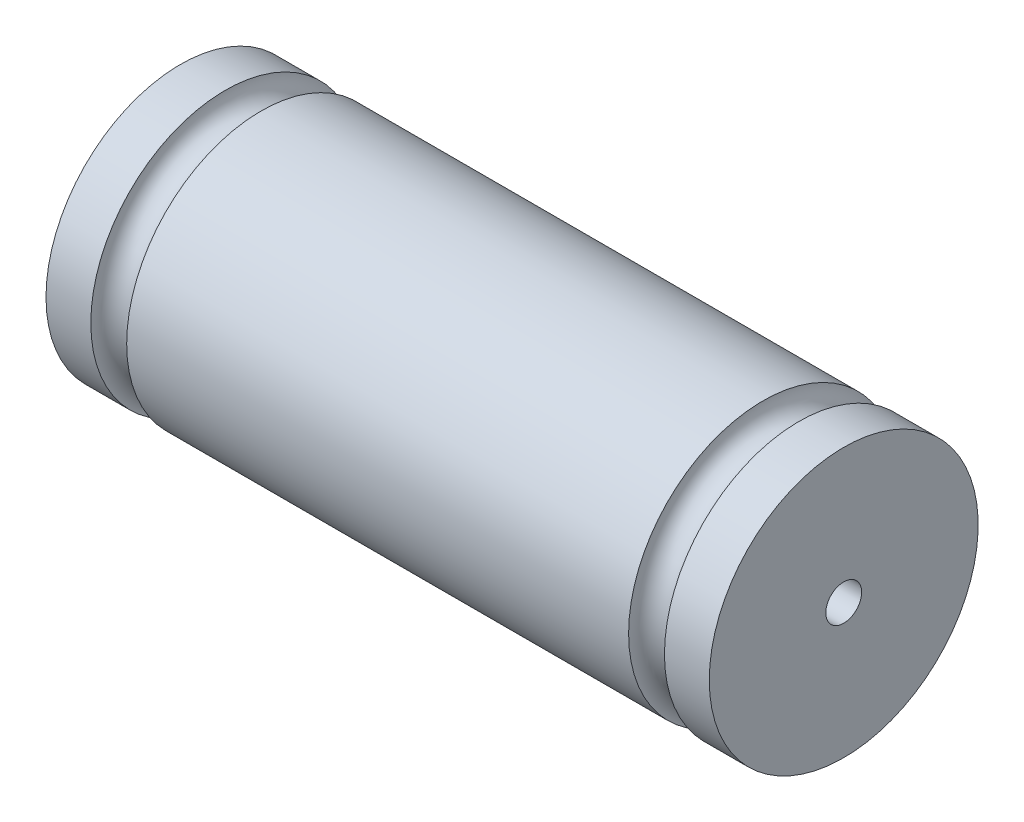
ISO-10303-21;
HEADER;
FILE_DESCRIPTION(('STEP AP214'),'2;1');
FILE_NAME('part.step','',(''),(''),'','','');
FILE_SCHEMA(('AUTOMOTIVE_DESIGN { 1 0 10303 214 1 1 1 1 }'));
ENDSEC;
DATA;
#1=APPLICATION_CONTEXT('core data for automotive mechanical design processes');
#2=APPLICATION_PROTOCOL_DEFINITION('international standard','automotive_design',2000,#1);
#3=PRODUCT_CONTEXT('',#1,'mechanical');
#4=PRODUCT('Part','Part','',(#3));
#5=PRODUCT_RELATED_PRODUCT_CATEGORY('part','',(#4));
#6=PRODUCT_DEFINITION_FORMATION('','',#4);
#7=PRODUCT_DEFINITION_CONTEXT('part definition',#1,'design');
#8=PRODUCT_DEFINITION('design','',#6,#7);
#9=PRODUCT_DEFINITION_SHAPE('','',#8);
#10=(LENGTH_UNIT() NAMED_UNIT(*) SI_UNIT(.MILLI.,.METRE.));
#11=(NAMED_UNIT(*) PLANE_ANGLE_UNIT() SI_UNIT($,.RADIAN.));
#12=(NAMED_UNIT(*) SI_UNIT($,.STERADIAN.) SOLID_ANGLE_UNIT());
#13=UNCERTAINTY_MEASURE_WITH_UNIT(LENGTH_MEASURE(1.E-05),#10,'distance_accuracy_value','');
#14=(GEOMETRIC_REPRESENTATION_CONTEXT(3) GLOBAL_UNCERTAINTY_ASSIGNED_CONTEXT((#13)) GLOBAL_UNIT_ASSIGNED_CONTEXT((#10,
#11,#12)) REPRESENTATION_CONTEXT('',''));
#15=CARTESIAN_POINT('',(0.,0.,0.));
#16=DIRECTION('',(0.,0.,1.));
#17=DIRECTION('',(1.,0.,0.));
#18=AXIS2_PLACEMENT_3D('',#15,#16,#17);
#19=CARTESIAN_POINT('',(-30.0000000000006,0.,0.));
#20=DIRECTION('',(-1.,0.,0.));
#21=DIRECTION('',(0.,0.,1.));
#22=AXIS2_PLACEMENT_3D('',#19,#20,#21);
#23=TOROIDAL_SURFACE('',#22,14.9999999999932,2.);
#24=CARTESIAN_POINT('',(-32.,0.,0.));
#25=DIRECTION('',(-1.,0.,0.));
#26=DIRECTION('',(0.,0.,1.));
#27=AXIS2_PLACEMENT_3D('',#24,#25,#26);
#28=CIRCLE('',#27,15.);
#29=CARTESIAN_POINT('',(-32.,0.,15.));
#30=VERTEX_POINT('',#29);
#31=EDGE_CURVE('E10',#30,#30,#28,.T.);
#32=ORIENTED_EDGE('',*,*,#31,.F.);
#33=EDGE_LOOP('',(#32));
#34=FACE_BOUND('',#33,.T.);
#35=CARTESIAN_POINT('',(-28.,0.,0.));
#36=DIRECTION('',(-1.,0.,0.));
#37=DIRECTION('',(0.,0.,1.));
#38=AXIS2_PLACEMENT_3D('',#35,#36,#37);
#39=CIRCLE('',#38,15.);
#40=CARTESIAN_POINT('',(-28.,0.,15.));
#41=VERTEX_POINT('',#40);
#42=EDGE_CURVE('E64',#41,#41,#39,.T.);
#43=ORIENTED_EDGE('',*,*,#42,.T.);
#44=EDGE_LOOP('',(#43));
#45=FACE_BOUND('',#44,.T.);
#46=ADVANCED_FACE('F36',(#34,#45),#23,.F.);
#47=CARTESIAN_POINT('',(0.,0.,0.));
#48=DIRECTION('',(-1.,0.,0.));
#49=DIRECTION('',(0.,0.,1.));
#50=AXIS2_PLACEMENT_3D('',#47,#48,#49);
#51=CYLINDRICAL_SURFACE('',#50,14.9999999999966);
#52=CARTESIAN_POINT('',(-37.,0.,0.));
#53=DIRECTION('',(-1.,0.,0.));
#54=DIRECTION('',(0.,0.,1.));
#55=AXIS2_PLACEMENT_3D('',#52,#53,#54);
#56=CIRCLE('',#55,14.9999999999932);
#57=CARTESIAN_POINT('',(-37.,0.,14.9999999999932));
#58=VERTEX_POINT('',#57);
#59=EDGE_CURVE('E42',#58,#58,#56,.T.);
#60=ORIENTED_EDGE('',*,*,#59,.F.);
#61=EDGE_LOOP('',(#60));
#62=FACE_BOUND('',#61,.T.);
#63=ORIENTED_EDGE('',*,*,#31,.T.);
#64=EDGE_LOOP('',(#63));
#65=FACE_BOUND('',#64,.T.);
#66=ADVANCED_FACE('F101',(#62,#65),#51,.T.);
#67=CARTESIAN_POINT('',(-37.,14.9999999999932,0.));
#68=DIRECTION('',(1.,0.,0.));
#69=DIRECTION('',(0.,0.,-1.));
#70=AXIS2_PLACEMENT_3D('',#67,#68,#69);
#71=PLANE('',#70);
#72=CARTESIAN_POINT('',(-37.,0.,0.));
#73=DIRECTION('',(-1.,0.,0.));
#74=DIRECTION('',(0.,0.,1.));
#75=AXIS2_PLACEMENT_3D('',#72,#73,#74);
#76=CIRCLE('',#75,2.);
#77=CARTESIAN_POINT('',(-37.,0.,2.));
#78=VERTEX_POINT('',#77);
#79=EDGE_CURVE('E46',#78,#78,#76,.T.);
#80=ORIENTED_EDGE('',*,*,#79,.F.);
#81=EDGE_LOOP('',(#80));
#82=FACE_BOUND('',#81,.T.);
#83=ORIENTED_EDGE('',*,*,#59,.T.);
#84=EDGE_LOOP('',(#83));
#85=FACE_BOUND('',#84,.T.);
#86=ADVANCED_FACE('F96',(#82,#85),#71,.F.);
#87=CARTESIAN_POINT('',(0.,0.,0.));
#88=DIRECTION('',(-1.,0.,0.));
#89=DIRECTION('',(0.,0.,1.));
#90=AXIS2_PLACEMENT_3D('',#87,#88,#89);
#91=CYLINDRICAL_SURFACE('',#90,2.);
#92=CARTESIAN_POINT('',(37.,0.,0.));
#93=DIRECTION('',(-1.,0.,0.));
#94=DIRECTION('',(0.,0.,1.));
#95=AXIS2_PLACEMENT_3D('',#92,#93,#94);
#96=CIRCLE('',#95,2.);
#97=CARTESIAN_POINT('',(37.,0.,2.));
#98=VERTEX_POINT('',#97);
#99=EDGE_CURVE('E50',#98,#98,#96,.T.);
#100=ORIENTED_EDGE('',*,*,#99,.F.);
#101=EDGE_LOOP('',(#100));
#102=FACE_BOUND('',#101,.T.);
#103=ORIENTED_EDGE('',*,*,#79,.T.);
#104=EDGE_LOOP('',(#103));
#105=FACE_BOUND('',#104,.T.);
#106=ADVANCED_FACE('F90',(#102,#105),#91,.F.);
#107=CARTESIAN_POINT('',(37.,14.999999999991,0.));
#108=DIRECTION('',(-1.,0.,0.));
#109=DIRECTION('',(0.,0.,1.));
#110=AXIS2_PLACEMENT_3D('',#107,#108,#109);
#111=PLANE('',#110);
#112=CARTESIAN_POINT('',(37.,0.,0.));
#113=DIRECTION('',(-1.,0.,0.));
#114=DIRECTION('',(0.,0.,1.));
#115=AXIS2_PLACEMENT_3D('',#112,#113,#114);
#116=CIRCLE('',#115,14.999999999991);
#117=CARTESIAN_POINT('',(37.,0.,14.999999999991));
#118=VERTEX_POINT('',#117);
#119=EDGE_CURVE('E55',#118,#118,#116,.T.);
#120=ORIENTED_EDGE('',*,*,#119,.F.);
#121=EDGE_LOOP('',(#120));
#122=FACE_BOUND('',#121,.T.);
#123=ORIENTED_EDGE('',*,*,#99,.T.);
#124=EDGE_LOOP('',(#123));
#125=FACE_BOUND('',#124,.T.);
#126=ADVANCED_FACE('F84',(#122,#125),#111,.F.);
#127=CARTESIAN_POINT('',(0.,0.,0.));
#128=DIRECTION('',(-1.,0.,0.));
#129=DIRECTION('',(0.,0.,1.));
#130=AXIS2_PLACEMENT_3D('',#127,#128,#129);
#131=CYLINDRICAL_SURFACE('',#130,14.9999999999955);
#132=CARTESIAN_POINT('',(32.,0.,0.));
#133=DIRECTION('',(-1.,0.,0.));
#134=DIRECTION('',(0.,0.,1.));
#135=AXIS2_PLACEMENT_3D('',#132,#133,#134);
#136=CIRCLE('',#135,15.);
#137=CARTESIAN_POINT('',(32.,0.,15.));
#138=VERTEX_POINT('',#137);
#139=EDGE_CURVE('E58',#138,#138,#136,.T.);
#140=ORIENTED_EDGE('',*,*,#139,.F.);
#141=EDGE_LOOP('',(#140));
#142=FACE_BOUND('',#141,.T.);
#143=ORIENTED_EDGE('',*,*,#119,.T.);
#144=EDGE_LOOP('',(#143));
#145=FACE_BOUND('',#144,.T.);
#146=ADVANCED_FACE('F78',(#142,#145),#131,.T.);
#147=CARTESIAN_POINT('',(30.000000000029,0.,0.));
#148=DIRECTION('',(-1.,0.,0.));
#149=DIRECTION('',(0.,0.,1.));
#150=AXIS2_PLACEMENT_3D('',#147,#148,#149);
#151=TOROIDAL_SURFACE('',#150,15.0000000000216,2.);
#152=CARTESIAN_POINT('',(28.000000000029,0.,0.));
#153=DIRECTION('',(-1.,0.,0.));
#154=DIRECTION('',(0.,0.,1.));
#155=AXIS2_PLACEMENT_3D('',#152,#153,#154);
#156=CIRCLE('',#155,15.);
#157=CARTESIAN_POINT('',(28.000000000029,0.,15.));
#158=VERTEX_POINT('',#157);
#159=EDGE_CURVE('E61',#158,#158,#156,.T.);
#160=ORIENTED_EDGE('',*,*,#159,.F.);
#161=EDGE_LOOP('',(#160));
#162=FACE_BOUND('',#161,.T.);
#163=ORIENTED_EDGE('',*,*,#139,.T.);
#164=EDGE_LOOP('',(#163));
#165=FACE_BOUND('',#164,.T.);
#166=ADVANCED_FACE('F72',(#162,#165),#151,.F.);
#167=CARTESIAN_POINT('',(0.,0.,0.));
#168=DIRECTION('',(-1.,0.,0.));
#169=DIRECTION('',(0.,0.,1.));
#170=AXIS2_PLACEMENT_3D('',#167,#168,#169);
#171=CYLINDRICAL_SURFACE('',#170,15.);
#172=ORIENTED_EDGE('',*,*,#42,.F.);
#173=EDGE_LOOP('',(#172));
#174=FACE_BOUND('',#173,.T.);
#175=ORIENTED_EDGE('',*,*,#159,.T.);
#176=EDGE_LOOP('',(#175));
#177=FACE_BOUND('',#176,.T.);
#178=ADVANCED_FACE('F69',(#174,#177),#171,.T.);
#179=CLOSED_SHELL('',(#46,#66,#86,#106,#126,#146,#166,#178));
#180=MANIFOLD_SOLID_BREP('B2',#179);
#181=ADVANCED_BREP_SHAPE_REPRESENTATION('',(#18,#180),#14);
#182=SHAPE_DEFINITION_REPRESENTATION(#9,#181);
ENDSEC;
END-ISO-10303-21;
